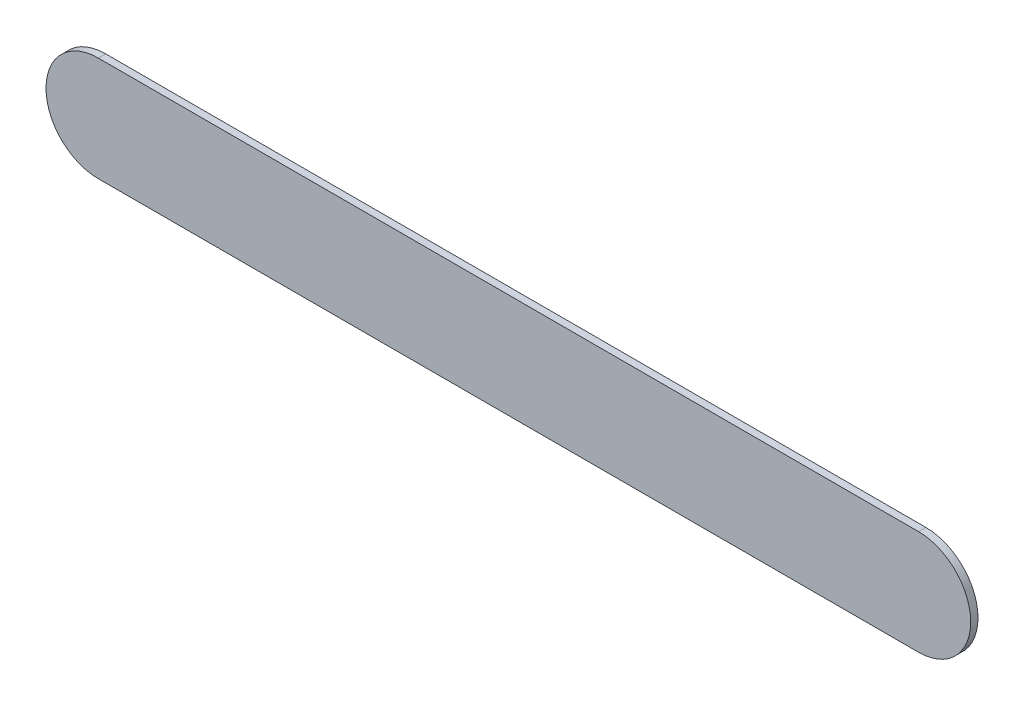
ISO-10303-21;
HEADER;
FILE_DESCRIPTION(('STEP AP214'),'2;1');
FILE_NAME('part.step','',(''),(''),'','','');
FILE_SCHEMA(('AUTOMOTIVE_DESIGN { 1 0 10303 214 1 1 1 1 }'));
ENDSEC;
DATA;
#1=APPLICATION_CONTEXT('core data for automotive mechanical design processes');
#2=APPLICATION_PROTOCOL_DEFINITION('international standard','automotive_design',2000,#1);
#3=PRODUCT_CONTEXT('',#1,'mechanical');
#4=PRODUCT('Part','Part','',(#3));
#5=PRODUCT_RELATED_PRODUCT_CATEGORY('part','',(#4));
#6=PRODUCT_DEFINITION_FORMATION('','',#4);
#7=PRODUCT_DEFINITION_CONTEXT('part definition',#1,'design');
#8=PRODUCT_DEFINITION('design','',#6,#7);
#9=PRODUCT_DEFINITION_SHAPE('','',#8);
#10=(LENGTH_UNIT() NAMED_UNIT(*) SI_UNIT(.MILLI.,.METRE.));
#11=(NAMED_UNIT(*) PLANE_ANGLE_UNIT() SI_UNIT($,.RADIAN.));
#12=(NAMED_UNIT(*) SI_UNIT($,.STERADIAN.) SOLID_ANGLE_UNIT());
#13=UNCERTAINTY_MEASURE_WITH_UNIT(LENGTH_MEASURE(1.E-05),#10,'distance_accuracy_value','');
#14=(GEOMETRIC_REPRESENTATION_CONTEXT(3) GLOBAL_UNCERTAINTY_ASSIGNED_CONTEXT((#13)) GLOBAL_UNIT_ASSIGNED_CONTEXT((#10,
#11,#12)) REPRESENTATION_CONTEXT('',''));
#15=CARTESIAN_POINT('',(0.,0.,0.));
#16=DIRECTION('',(0.,0.,1.));
#17=DIRECTION('',(1.,0.,0.));
#18=AXIS2_PLACEMENT_3D('',#15,#16,#17);
#19=CARTESIAN_POINT('',(107.78,-97.782,1.635));
#20=DIRECTION('',(0.,0.,1.));
#21=DIRECTION('',(1.,0.,0.));
#22=AXIS2_PLACEMENT_3D('',#19,#20,#21);
#23=PLANE('',#22);
#24=DIRECTION('',(-1.,0.,0.));
#25=VECTOR('',#24,1.);
#26=CARTESIAN_POINT('',(107.78,-97.782,1.635));
#27=LINE('',#26,#25);
#28=CARTESIAN_POINT('',(107.78,-97.782,1.635));
#29=VERTEX_POINT('',#28);
#30=CARTESIAN_POINT('',(103.855,-97.782,1.635));
#31=VERTEX_POINT('',#30);
#32=EDGE_CURVE('E81',#29,#31,#27,.T.);
#33=ORIENTED_EDGE('',*,*,#32,.T.);
#34=CARTESIAN_POINT('',(103.855,-98.032,1.635));
#35=DIRECTION('',(0.,0.,1.));
#36=DIRECTION('',(0.,1.,0.));
#37=AXIS2_PLACEMENT_3D('',#34,#35,#36);
#38=CIRCLE('',#37,0.25);
#39=CARTESIAN_POINT('',(103.855,-98.282,1.635));
#40=VERTEX_POINT('',#39);
#41=EDGE_CURVE('E101',#31,#40,#38,.T.);
#42=ORIENTED_EDGE('',*,*,#41,.T.);
#43=DIRECTION('',(1.,0.,0.));
#44=VECTOR('',#43,1.);
#45=CARTESIAN_POINT('',(103.855,-98.282,1.635));
#46=LINE('',#45,#44);
#47=CARTESIAN_POINT('',(107.78,-98.282,1.635));
#48=VERTEX_POINT('',#47);
#49=EDGE_CURVE('E74',#40,#48,#46,.T.);
#50=ORIENTED_EDGE('',*,*,#49,.T.);
#51=CARTESIAN_POINT('',(107.78,-98.032,1.635));
#52=DIRECTION('',(0.,0.,1.));
#53=DIRECTION('',(0.,-1.,0.));
#54=AXIS2_PLACEMENT_3D('',#51,#52,#53);
#55=CIRCLE('',#54,0.25);
#56=EDGE_CURVE('E11',#48,#29,#55,.T.);
#57=ORIENTED_EDGE('',*,*,#56,.T.);
#58=EDGE_LOOP('',(#33,#42,#50,#57));
#59=FACE_BOUND('',#58,.T.);
#60=ADVANCED_FACE('F17',(#59),#23,.T.);
#61=CARTESIAN_POINT('',(107.78,-97.782,1.6));
#62=DIRECTION('',(0.,0.,1.));
#63=DIRECTION('',(1.,0.,0.));
#64=AXIS2_PLACEMENT_3D('',#61,#62,#63);
#65=PLANE('',#64);
#66=CARTESIAN_POINT('',(107.78,-98.032,1.6));
#67=DIRECTION('',(0.,0.,1.));
#68=DIRECTION('',(0.,-1.,0.));
#69=AXIS2_PLACEMENT_3D('',#66,#67,#68);
#70=CIRCLE('',#69,0.25);
#71=CARTESIAN_POINT('',(107.78,-98.282,1.6));
#72=VERTEX_POINT('',#71);
#73=CARTESIAN_POINT('',(107.78,-97.782,1.6));
#74=VERTEX_POINT('',#73);
#75=EDGE_CURVE('E20',#72,#74,#70,.T.);
#76=ORIENTED_EDGE('',*,*,#75,.F.);
#77=DIRECTION('',(1.,0.,0.));
#78=VECTOR('',#77,1.);
#79=CARTESIAN_POINT('',(103.855,-98.282,1.6));
#80=LINE('',#79,#78);
#81=CARTESIAN_POINT('',(103.855,-98.282,1.6));
#82=VERTEX_POINT('',#81);
#83=EDGE_CURVE('E99',#82,#72,#80,.T.);
#84=ORIENTED_EDGE('',*,*,#83,.F.);
#85=CARTESIAN_POINT('',(103.855,-98.032,1.6));
#86=DIRECTION('',(0.,0.,1.));
#87=DIRECTION('',(0.,1.,0.));
#88=AXIS2_PLACEMENT_3D('',#85,#86,#87);
#89=CIRCLE('',#88,0.25);
#90=CARTESIAN_POINT('',(103.855,-97.782,1.6));
#91=VERTEX_POINT('',#90);
#92=EDGE_CURVE('E83',#91,#82,#89,.T.);
#93=ORIENTED_EDGE('',*,*,#92,.F.);
#94=DIRECTION('',(-1.,0.,0.));
#95=VECTOR('',#94,1.);
#96=CARTESIAN_POINT('',(107.78,-97.782,1.6));
#97=LINE('',#96,#95);
#98=EDGE_CURVE('E79',#74,#91,#97,.T.);
#99=ORIENTED_EDGE('',*,*,#98,.F.);
#100=EDGE_LOOP('',(#76,#84,#93,#99));
#101=FACE_BOUND('',#100,.T.);
#102=ADVANCED_FACE('F85',(#101),#65,.F.);
#103=CARTESIAN_POINT('',(107.78,-98.032,1.6));
#104=DIRECTION('',(0.,0.,-1.));
#105=DIRECTION('',(0.,-1.,0.));
#106=AXIS2_PLACEMENT_3D('',#103,#104,#105);
#107=CYLINDRICAL_SURFACE('',#106,0.25);
#108=ORIENTED_EDGE('',*,*,#75,.T.);
#109=DIRECTION('',(0.,0.,1.));
#110=VECTOR('',#109,1.);
#111=CARTESIAN_POINT('',(107.78,-97.782,1.6));
#112=LINE('',#111,#110);
#113=EDGE_CURVE('E68',#74,#29,#112,.T.);
#114=ORIENTED_EDGE('',*,*,#113,.T.);
#115=ORIENTED_EDGE('',*,*,#56,.F.);
#116=DIRECTION('',(0.,0.,1.));
#117=VECTOR('',#116,1.);
#118=CARTESIAN_POINT('',(107.78,-98.282,1.6));
#119=LINE('',#118,#117);
#120=EDGE_CURVE('E71',#72,#48,#119,.T.);
#121=ORIENTED_EDGE('',*,*,#120,.F.);
#122=EDGE_LOOP('',(#108,#114,#115,#121));
#123=FACE_BOUND('',#122,.T.);
#124=ADVANCED_FACE('F67',(#123),#107,.T.);
#125=CARTESIAN_POINT('',(103.855,-98.282,1.6));
#126=DIRECTION('',(0.,1.,0.));
#127=DIRECTION('',(1.,0.,0.));
#128=AXIS2_PLACEMENT_3D('',#125,#126,#127);
#129=PLANE('',#128);
#130=ORIENTED_EDGE('',*,*,#83,.T.);
#131=ORIENTED_EDGE('',*,*,#120,.T.);
#132=ORIENTED_EDGE('',*,*,#49,.F.);
#133=DIRECTION('',(0.,0.,1.));
#134=VECTOR('',#133,1.);
#135=CARTESIAN_POINT('',(103.855,-98.282,1.6));
#136=LINE('',#135,#134);
#137=EDGE_CURVE('E105',#82,#40,#136,.T.);
#138=ORIENTED_EDGE('',*,*,#137,.F.);
#139=EDGE_LOOP('',(#130,#131,#132,#138));
#140=FACE_BOUND('',#139,.T.);
#141=ADVANCED_FACE('F117',(#140),#129,.F.);
#142=CARTESIAN_POINT('',(103.855,-98.032,1.6));
#143=DIRECTION('',(0.,0.,-1.));
#144=DIRECTION('',(0.,1.,0.));
#145=AXIS2_PLACEMENT_3D('',#142,#143,#144);
#146=CYLINDRICAL_SURFACE('',#145,0.25);
#147=ORIENTED_EDGE('',*,*,#92,.T.);
#148=ORIENTED_EDGE('',*,*,#137,.T.);
#149=ORIENTED_EDGE('',*,*,#41,.F.);
#150=DIRECTION('',(0.,0.,1.));
#151=VECTOR('',#150,1.);
#152=CARTESIAN_POINT('',(103.855,-97.782,1.6));
#153=LINE('',#152,#151);
#154=EDGE_CURVE('E89',#91,#31,#153,.T.);
#155=ORIENTED_EDGE('',*,*,#154,.F.);
#156=EDGE_LOOP('',(#147,#148,#149,#155));
#157=FACE_BOUND('',#156,.T.);
#158=ADVANCED_FACE('F119',(#157),#146,.T.);
#159=CARTESIAN_POINT('',(107.78,-97.782,1.6));
#160=DIRECTION('',(0.,-1.,0.));
#161=DIRECTION('',(0.,0.,-1.));
#162=AXIS2_PLACEMENT_3D('',#159,#160,#161);
#163=PLANE('',#162);
#164=ORIENTED_EDGE('',*,*,#98,.T.);
#165=ORIENTED_EDGE('',*,*,#154,.T.);
#166=ORIENTED_EDGE('',*,*,#32,.F.);
#167=ORIENTED_EDGE('',*,*,#113,.F.);
#168=EDGE_LOOP('',(#164,#165,#166,#167));
#169=FACE_BOUND('',#168,.T.);
#170=ADVANCED_FACE('F77',(#169),#163,.F.);
#171=CLOSED_SHELL('',(#60,#102,#124,#141,#158,#170));
#172=MANIFOLD_SOLID_BREP('B1',#171);
#173=ADVANCED_BREP_SHAPE_REPRESENTATION('',(#18,#172),#14);
#174=SHAPE_DEFINITION_REPRESENTATION(#9,#173);
ENDSEC;
END-ISO-10303-21;
